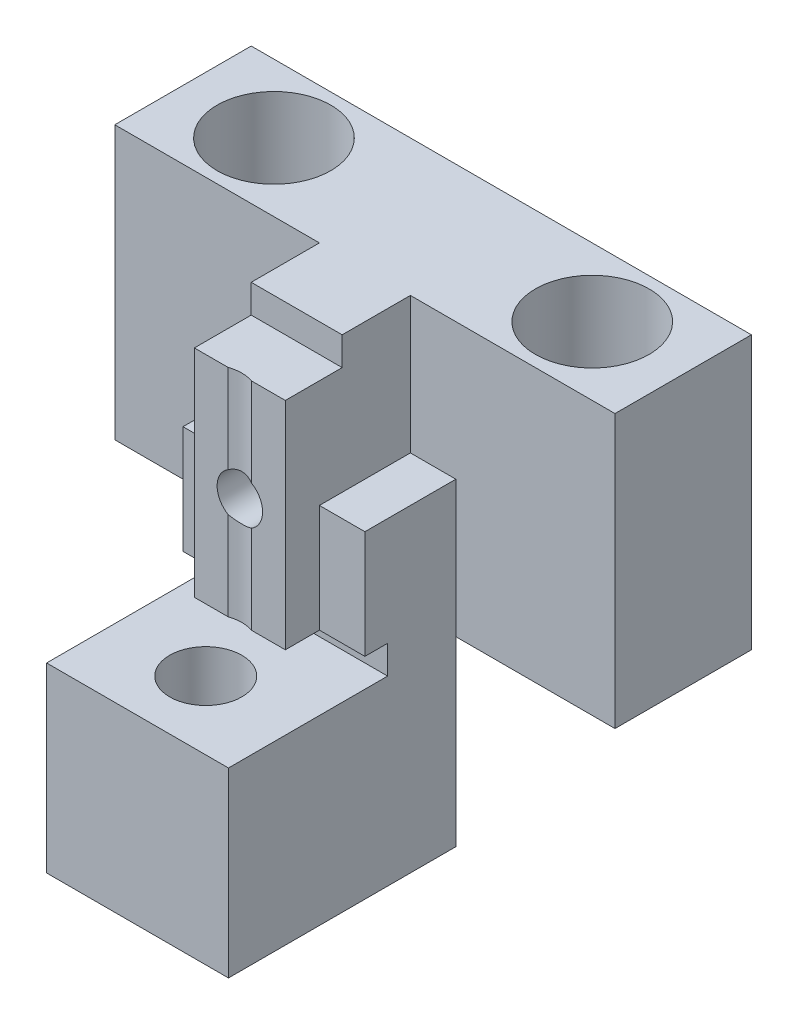
ISO-10303-21;
HEADER;
FILE_DESCRIPTION(('STEP AP214'),'2;1');
FILE_NAME('part.step','',(''),(''),'','','');
FILE_SCHEMA(('AUTOMOTIVE_DESIGN { 1 0 10303 214 1 1 1 1 }'));
ENDSEC;
DATA;
#1=APPLICATION_CONTEXT('core data for automotive mechanical design processes');
#2=APPLICATION_PROTOCOL_DEFINITION('international standard','automotive_design',2000,#1);
#3=PRODUCT_CONTEXT('',#1,'mechanical');
#4=PRODUCT('Part','Part','',(#3));
#5=PRODUCT_RELATED_PRODUCT_CATEGORY('part','',(#4));
#6=PRODUCT_DEFINITION_FORMATION('','',#4);
#7=PRODUCT_DEFINITION_CONTEXT('part definition',#1,'design');
#8=PRODUCT_DEFINITION('design','',#6,#7);
#9=PRODUCT_DEFINITION_SHAPE('','',#8);
#10=(LENGTH_UNIT() NAMED_UNIT(*) SI_UNIT(.MILLI.,.METRE.));
#11=(NAMED_UNIT(*) PLANE_ANGLE_UNIT() SI_UNIT($,.RADIAN.));
#12=(NAMED_UNIT(*) SI_UNIT($,.STERADIAN.) SOLID_ANGLE_UNIT());
#13=UNCERTAINTY_MEASURE_WITH_UNIT(LENGTH_MEASURE(1.E-05),#10,'distance_accuracy_value','');
#14=(GEOMETRIC_REPRESENTATION_CONTEXT(3) GLOBAL_UNCERTAINTY_ASSIGNED_CONTEXT((#13)) GLOBAL_UNIT_ASSIGNED_CONTEXT((#10,
#11,#12)) REPRESENTATION_CONTEXT('',''));
#15=CARTESIAN_POINT('',(0.,0.,0.));
#16=DIRECTION('',(0.,0.,1.));
#17=DIRECTION('',(1.,0.,0.));
#18=AXIS2_PLACEMENT_3D('',#15,#16,#17);
#19=CARTESIAN_POINT('',(0.,-28.,26.));
#20=DIRECTION('',(0.,1.,0.));
#21=DIRECTION('',(0.,0.,1.));
#22=AXIS2_PLACEMENT_3D('',#19,#20,#21);
#23=CYLINDRICAL_SURFACE('',#22,3.175);
#24=CARTESIAN_POINT('',(0.,-28.,26.));
#25=DIRECTION('',(0.,1.,0.));
#26=DIRECTION('',(0.,0.,1.));
#27=AXIS2_PLACEMENT_3D('',#24,#25,#26);
#28=CIRCLE('',#27,3.175);
#29=CARTESIAN_POINT('',(0.,-28.,29.175));
#30=VERTEX_POINT('',#29);
#31=EDGE_CURVE('E270',#30,#30,#28,.T.);
#32=ORIENTED_EDGE('',*,*,#31,.F.);
#33=EDGE_LOOP('',(#32));
#34=FACE_BOUND('',#33,.T.);
#35=CARTESIAN_POINT('',(0.,-12.,26.));
#36=DIRECTION('',(0.,-1.,0.));
#37=DIRECTION('',(0.,0.,-1.));
#38=AXIS2_PLACEMENT_3D('',#35,#36,#37);
#39=CIRCLE('',#38,3.175);
#40=CARTESIAN_POINT('',(0.,-12.,22.825));
#41=VERTEX_POINT('',#40);
#42=EDGE_CURVE('E399',#41,#41,#39,.T.);
#43=ORIENTED_EDGE('',*,*,#42,.F.);
#44=EDGE_LOOP('',(#43));
#45=FACE_BOUND('',#44,.T.);
#46=ADVANCED_FACE('F41',(#34,#45),#23,.F.);
#47=CARTESIAN_POINT('',(0.,0.,23.));
#48=DIRECTION('',(0.,0.,-1.));
#49=DIRECTION('',(-1.,0.,0.));
#50=AXIS2_PLACEMENT_3D('',#47,#48,#49);
#51=PLANE('',#50);
#52=DIRECTION('',(0.,-1.,0.));
#53=VECTOR('',#52,1.);
#54=CARTESIAN_POINT('',(-4.,-12.,23.));
#55=LINE('',#54,#53);
#56=CARTESIAN_POINT('',(-4.,9.5,23.));
#57=VERTEX_POINT('',#56);
#58=CARTESIAN_POINT('',(-4.,-9.5,23.));
#59=VERTEX_POINT('',#58);
#60=EDGE_CURVE('E235',#57,#59,#55,.T.);
#61=ORIENTED_EDGE('',*,*,#60,.T.);
#62=DIRECTION('',(1.,0.,0.));
#63=VECTOR('',#62,1.);
#64=CARTESIAN_POINT('',(0.,-9.5,23.));
#65=LINE('',#64,#63);
#66=CARTESIAN_POINT('',(-1.03953114431459,-9.5,23.));
#67=VERTEX_POINT('',#66);
#68=EDGE_CURVE('E252',#59,#67,#65,.T.);
#69=ORIENTED_EDGE('',*,*,#68,.T.);
#70=DIRECTION('',(0.,1.,0.));
#71=VECTOR('',#70,1.);
#72=CARTESIAN_POINT('',(-1.03953114431459,-28.,23.));
#73=LINE('',#72,#71);
#74=CARTESIAN_POINT('',(-1.03953114431459,-1.70861786248418,23.));
#75=VERTEX_POINT('',#74);
#76=EDGE_CURVE('E280',#67,#75,#73,.T.);
#77=ORIENTED_EDGE('',*,*,#76,.T.);
#78=CARTESIAN_POINT('',(0.,0.,23.));
#79=DIRECTION('',(0.,0.,1.));
#80=DIRECTION('',(1.,0.,0.));
#81=AXIS2_PLACEMENT_3D('',#78,#79,#80);
#82=CIRCLE('',#81,2.);
#83=CARTESIAN_POINT('',(-1.03953114431459,1.70861786248418,23.));
#84=VERTEX_POINT('',#83);
#85=EDGE_CURVE('E268',#84,#75,#82,.T.);
#86=ORIENTED_EDGE('',*,*,#85,.F.);
#87=CARTESIAN_POINT('',(-1.03953114431459,9.5,23.));
#88=VERTEX_POINT('',#87);
#89=EDGE_CURVE('E277',#84,#88,#73,.T.);
#90=ORIENTED_EDGE('',*,*,#89,.T.);
#91=DIRECTION('',(-1.,0.,0.));
#92=VECTOR('',#91,1.);
#93=CARTESIAN_POINT('',(0.,9.5,23.));
#94=LINE('',#93,#92);
#95=EDGE_CURVE('E63',#88,#57,#94,.T.);
#96=ORIENTED_EDGE('',*,*,#95,.T.);
#97=EDGE_LOOP('',(#61,#69,#77,#86,#90,#96));
#98=FACE_BOUND('',#97,.T.);
#99=ADVANCED_FACE('F443',(#98),#51,.F.);
#100=DIRECTION('',(0.,1.,0.));
#101=VECTOR('',#100,1.);
#102=CARTESIAN_POINT('',(1.03953114431459,-28.,23.));
#103=LINE('',#102,#101);
#104=CARTESIAN_POINT('',(1.03953114431459,-1.70861786248418,23.));
#105=VERTEX_POINT('',#104);
#106=CARTESIAN_POINT('',(1.03953114431459,-9.5,23.));
#107=VERTEX_POINT('',#106);
#108=EDGE_CURVE('E272',#105,#107,#103,.F.);
#109=ORIENTED_EDGE('',*,*,#108,.T.);
#110=DIRECTION('',(1.,0.,0.));
#111=VECTOR('',#110,1.);
#112=CARTESIAN_POINT('',(0.,-9.5,23.));
#113=LINE('',#112,#111);
#114=CARTESIAN_POINT('',(4.,-9.5,23.));
#115=VERTEX_POINT('',#114);
#116=EDGE_CURVE('E247',#107,#115,#113,.T.);
#117=ORIENTED_EDGE('',*,*,#116,.T.);
#118=DIRECTION('',(0.,1.,0.));
#119=VECTOR('',#118,1.);
#120=CARTESIAN_POINT('',(4.,-12.,23.));
#121=LINE('',#120,#119);
#122=CARTESIAN_POINT('',(4.,9.5,23.));
#123=VERTEX_POINT('',#122);
#124=EDGE_CURVE('E347',#115,#123,#121,.T.);
#125=ORIENTED_EDGE('',*,*,#124,.T.);
#126=DIRECTION('',(-1.,0.,0.));
#127=VECTOR('',#126,1.);
#128=CARTESIAN_POINT('',(0.,9.5,23.));
#129=LINE('',#128,#127);
#130=CARTESIAN_POINT('',(1.03953114431459,9.5,23.));
#131=VERTEX_POINT('',#130);
#132=EDGE_CURVE('E480',#123,#131,#129,.T.);
#133=ORIENTED_EDGE('',*,*,#132,.T.);
#134=CARTESIAN_POINT('',(1.03953114431459,1.70861786248418,23.));
#135=VERTEX_POINT('',#134);
#136=EDGE_CURVE('E273',#131,#135,#103,.F.);
#137=ORIENTED_EDGE('',*,*,#136,.T.);
#138=EDGE_CURVE('E218',#105,#135,#82,.T.);
#139=ORIENTED_EDGE('',*,*,#138,.F.);
#140=EDGE_LOOP('',(#109,#117,#125,#133,#137,#139));
#141=FACE_BOUND('',#140,.T.);
#142=ADVANCED_FACE('F452',(#141),#51,.F.);
#143=ORIENTED_EDGE('',*,*,#76,.F.);
#144=CARTESIAN_POINT('',(0.,-9.5,26.));
#145=DIRECTION('',(0.,1.,0.));
#146=DIRECTION('',(0.,0.,1.));
#147=AXIS2_PLACEMENT_3D('',#144,#145,#146);
#148=CIRCLE('',#147,3.175);
#149=EDGE_CURVE('E249',#67,#107,#148,.F.);
#150=ORIENTED_EDGE('',*,*,#149,.T.);
#151=ORIENTED_EDGE('',*,*,#108,.F.);
#152=CARTESIAN_POINT('',(1.03953114431459,-1.70861786248418,23.));
#153=CARTESIAN_POINT('',(0.997541196131157,-1.73416155510602,22.9854493533525));
#154=CARTESIAN_POINT('',(0.954468028573031,-1.75824815036549,22.9715134937365));
#155=CARTESIAN_POINT('',(0.866270296265234,-1.80334025385913,22.9451147473165));
#156=CARTESIAN_POINT('',(0.82114445006788,-1.82434380184566,22.932652798617));
#157=CARTESIAN_POINT('',(0.682730376898107,-1.88252250413973,22.8978166729353));
#158=CARTESIAN_POINT('',(0.58660053493359,-1.91474621238144,22.8780616596835));
#159=CARTESIAN_POINT('',(0.38883984730089,-1.96449549665803,22.8473055847078));
#160=CARTESIAN_POINT('',(0.287188754412404,-1.98196245514864,22.8363394433755));
#161=CARTESIAN_POINT('',(0.0820302804462668,-2.00096077241309,22.8244037033069));
#162=CARTESIAN_POINT('',(-0.0214720691625581,-2.00253021424698,22.8234102147819));
#163=CARTESIAN_POINT('',(-0.220353692033777,-1.9901584733068,22.8311928539617));
#164=CARTESIAN_POINT('',(-0.315823650079891,-1.97721890119488,22.8393381220084));
#165=CARTESIAN_POINT('',(-0.503073675052056,-1.93805978380155,22.8636858429527));
#166=CARTESIAN_POINT('',(-0.594848102293492,-1.91182071409481,22.8799001410116));
#167=CARTESIAN_POINT('',(-0.746359528962167,-1.85672246990572,22.9133003303401));
#168=CARTESIAN_POINT('',(-0.807604340821068,-1.83088392427938,22.9288093655041));
#169=CARTESIAN_POINT('',(-0.926381400413361,-1.77373720944711,22.9625252001862));
#170=CARTESIAN_POINT('',(-0.983927919248732,-1.74245204013732,22.980720608505));
#171=CARTESIAN_POINT('',(-1.03953114431459,-1.70861786248418,23.));
#172=B_SPLINE_CURVE_WITH_KNOTS('',3,(#152,#153,#154,#155,#156,#157,#158,#159,#160,#161,#162,
#163,#164,#165,#166,#167,#168,#169,#170,#171),.UNSPECIFIED.,.F.,.F.,(4,2,2,2,2,2,2,2,2,4),(0.,
0.15370416847276,0.307505644939282,0.615817365193148,0.925348095150154,1.2341371574996,
1.52285390286286,1.81199573394711,2.01641354175181,2.21998819660838),.UNSPECIFIED.);
#173=EDGE_CURVE('E412',#105,#75,#172,.T.);
#174=ORIENTED_EDGE('',*,*,#173,.T.);
#175=EDGE_LOOP('',(#143,#150,#151,#174));
#176=FACE_BOUND('',#175,.T.);
#177=ADVANCED_FACE('F446',(#176),#23,.F.);
#178=CARTESIAN_POINT('',(-22.,12.,12.));
#179=DIRECTION('',(0.,-1.,0.));
#180=DIRECTION('',(0.,0.,-1.));
#181=AXIS2_PLACEMENT_3D('',#178,#179,#180);
#182=PLANE('',#181);
#183=CARTESIAN_POINT('',(14.,12.,6.));
#184=DIRECTION('',(0.,1.,0.));
#185=DIRECTION('',(0.,0.,1.));
#186=AXIS2_PLACEMENT_3D('',#183,#184,#185);
#187=CIRCLE('',#186,5.);
#188=CARTESIAN_POINT('',(14.,12.,11.));
#189=VERTEX_POINT('',#188);
#190=EDGE_CURVE('E276',#189,#189,#187,.T.);
#191=ORIENTED_EDGE('',*,*,#190,.F.);
#192=EDGE_LOOP('',(#191));
#193=FACE_BOUND('',#192,.T.);
#194=CARTESIAN_POINT('',(-14.,12.,6.));
#195=DIRECTION('',(0.,1.,0.));
#196=DIRECTION('',(0.,0.,1.));
#197=AXIS2_PLACEMENT_3D('',#194,#195,#196);
#198=CIRCLE('',#197,5.);
#199=CARTESIAN_POINT('',(-14.,12.,11.));
#200=VERTEX_POINT('',#199);
#201=EDGE_CURVE('E278',#200,#200,#198,.T.);
#202=ORIENTED_EDGE('',*,*,#201,.F.);
#203=EDGE_LOOP('',(#202));
#204=FACE_BOUND('',#203,.T.);
#205=DIRECTION('',(0.,0.,-1.));
#206=VECTOR('',#205,1.);
#207=CARTESIAN_POINT('',(-4.,12.,23.));
#208=LINE('',#207,#206);
#209=CARTESIAN_POINT('',(-4.,12.,18.));
#210=VERTEX_POINT('',#209);
#211=CARTESIAN_POINT('',(-4.,12.,12.));
#212=VERTEX_POINT('',#211);
#213=EDGE_CURVE('E348',#210,#212,#208,.T.);
#214=ORIENTED_EDGE('',*,*,#213,.F.);
#215=DIRECTION('',(1.,0.,0.));
#216=VECTOR('',#215,1.);
#217=CARTESIAN_POINT('',(-22.,12.,18.));
#218=LINE('',#217,#216);
#219=CARTESIAN_POINT('',(4.,12.,18.));
#220=VERTEX_POINT('',#219);
#221=EDGE_CURVE('E214',#210,#220,#218,.T.);
#222=ORIENTED_EDGE('',*,*,#221,.T.);
#223=DIRECTION('',(0.,0.,-1.));
#224=VECTOR('',#223,1.);
#225=CARTESIAN_POINT('',(4.,12.,23.));
#226=LINE('',#225,#224);
#227=CARTESIAN_POINT('',(4.,12.,12.));
#228=VERTEX_POINT('',#227);
#229=EDGE_CURVE('E357',#220,#228,#226,.T.);
#230=ORIENTED_EDGE('',*,*,#229,.T.);
#231=DIRECTION('',(-1.,0.,0.));
#232=VECTOR('',#231,1.);
#233=CARTESIAN_POINT('',(-22.,12.,12.));
#234=LINE('',#233,#232);
#235=CARTESIAN_POINT('',(22.,12.,12.));
#236=VERTEX_POINT('',#235);
#237=EDGE_CURVE('E371',#236,#228,#234,.T.);
#238=ORIENTED_EDGE('',*,*,#237,.F.);
#239=DIRECTION('',(0.,0.,-1.));
#240=VECTOR('',#239,1.);
#241=CARTESIAN_POINT('',(22.,12.,12.));
#242=LINE('',#241,#240);
#243=CARTESIAN_POINT('',(22.,12.,0.));
#244=VERTEX_POINT('',#243);
#245=EDGE_CURVE('E383',#236,#244,#242,.T.);
#246=ORIENTED_EDGE('',*,*,#245,.T.);
#247=DIRECTION('',(-1.,0.,0.));
#248=VECTOR('',#247,1.);
#249=CARTESIAN_POINT('',(-22.,12.,0.));
#250=LINE('',#249,#248);
#251=CARTESIAN_POINT('',(-22.,12.,0.));
#252=VERTEX_POINT('',#251);
#253=EDGE_CURVE('E361',#244,#252,#250,.T.);
#254=ORIENTED_EDGE('',*,*,#253,.T.);
#255=DIRECTION('',(0.,0.,-1.));
#256=VECTOR('',#255,1.);
#257=CARTESIAN_POINT('',(-22.,12.,12.));
#258=LINE('',#257,#256);
#259=CARTESIAN_POINT('',(-22.,12.,12.));
#260=VERTEX_POINT('',#259);
#261=EDGE_CURVE('E372',#260,#252,#258,.T.);
#262=ORIENTED_EDGE('',*,*,#261,.F.);
#263=EDGE_CURVE('E367',#212,#260,#234,.T.);
#264=ORIENTED_EDGE('',*,*,#263,.F.);
#265=EDGE_LOOP('',(#214,#222,#230,#238,#246,#254,#262,#264));
#266=FACE_BOUND('',#265,.T.);
#267=ADVANCED_FACE('F460',(#193,#204,#266),#182,.F.);
#268=CARTESIAN_POINT('',(0.,0.,20.));
#269=DIRECTION('',(0.,0.,-1.));
#270=DIRECTION('',(-1.,0.,0.));
#271=AXIS2_PLACEMENT_3D('',#268,#269,#270);
#272=PLANE('',#271);
#273=DIRECTION('',(0.,-1.,0.));
#274=VECTOR('',#273,1.);
#275=CARTESIAN_POINT('',(4.,-12.,20.));
#276=LINE('',#275,#274);
#277=CARTESIAN_POINT('',(4.,0.,20.));
#278=VERTEX_POINT('',#277);
#279=CARTESIAN_POINT('',(4.,-9.5,20.));
#280=VERTEX_POINT('',#279);
#281=EDGE_CURVE('E395',#278,#280,#276,.T.);
#282=ORIENTED_EDGE('',*,*,#281,.T.);
#283=DIRECTION('',(1.,0.,0.));
#284=VECTOR('',#283,1.);
#285=CARTESIAN_POINT('',(0.,-9.5,20.));
#286=LINE('',#285,#284);
#287=CARTESIAN_POINT('',(8.,-9.5,20.));
#288=VERTEX_POINT('',#287);
#289=EDGE_CURVE('E237',#280,#288,#286,.T.);
#290=ORIENTED_EDGE('',*,*,#289,.T.);
#291=DIRECTION('',(0.,1.,0.));
#292=VECTOR('',#291,1.);
#293=CARTESIAN_POINT('',(8.,-28.,20.));
#294=LINE('',#293,#292);
#295=CARTESIAN_POINT('',(8.,0.,20.));
#296=VERTEX_POINT('',#295);
#297=EDGE_CURVE('E306',#288,#296,#294,.T.);
#298=ORIENTED_EDGE('',*,*,#297,.T.);
#299=DIRECTION('',(-1.,0.,0.));
#300=VECTOR('',#299,1.);
#301=CARTESIAN_POINT('',(-8.,0.,20.));
#302=LINE('',#301,#300);
#303=EDGE_CURVE('E315',#296,#278,#302,.T.);
#304=ORIENTED_EDGE('',*,*,#303,.T.);
#305=EDGE_LOOP('',(#282,#290,#298,#304));
#306=FACE_BOUND('',#305,.T.);
#307=ADVANCED_FACE('F493',(#306),#272,.F.);
#308=DIRECTION('',(0.,-1.,0.));
#309=VECTOR('',#308,1.);
#310=CARTESIAN_POINT('',(-8.,-28.,20.));
#311=LINE('',#310,#309);
#312=CARTESIAN_POINT('',(-8.,0.,20.));
#313=VERTEX_POINT('',#312);
#314=CARTESIAN_POINT('',(-8.,-9.5,20.));
#315=VERTEX_POINT('',#314);
#316=EDGE_CURVE('E301',#313,#315,#311,.T.);
#317=ORIENTED_EDGE('',*,*,#316,.T.);
#318=DIRECTION('',(1.,0.,0.));
#319=VECTOR('',#318,1.);
#320=CARTESIAN_POINT('',(0.,-9.5,20.));
#321=LINE('',#320,#319);
#322=CARTESIAN_POINT('',(-4.,-9.5,20.));
#323=VERTEX_POINT('',#322);
#324=EDGE_CURVE('E260',#315,#323,#321,.T.);
#325=ORIENTED_EDGE('',*,*,#324,.T.);
#326=DIRECTION('',(0.,1.,0.));
#327=VECTOR('',#326,1.);
#328=CARTESIAN_POINT('',(-4.,-12.,20.));
#329=LINE('',#328,#327);
#330=CARTESIAN_POINT('',(-4.,0.,20.));
#331=VERTEX_POINT('',#330);
#332=EDGE_CURVE('E338',#323,#331,#329,.T.);
#333=ORIENTED_EDGE('',*,*,#332,.T.);
#334=EDGE_CURVE('E313',#331,#313,#302,.T.);
#335=ORIENTED_EDGE('',*,*,#334,.T.);
#336=EDGE_LOOP('',(#317,#325,#333,#335));
#337=FACE_BOUND('',#336,.T.);
#338=ADVANCED_FACE('F526',(#337),#272,.F.);
#339=CARTESIAN_POINT('',(0.,0.,12.));
#340=DIRECTION('',(0.,0.,-1.));
#341=DIRECTION('',(-1.,0.,0.));
#342=AXIS2_PLACEMENT_3D('',#339,#340,#341);
#343=PLANE('',#342);
#344=DIRECTION('',(0.,-1.,0.));
#345=VECTOR('',#344,1.);
#346=CARTESIAN_POINT('',(-8.,-28.,12.));
#347=LINE('',#346,#345);
#348=CARTESIAN_POINT('',(-8.,0.,12.));
#349=VERTEX_POINT('',#348);
#350=CARTESIAN_POINT('',(-8.,-12.,12.));
#351=VERTEX_POINT('',#350);
#352=EDGE_CURVE('E316',#349,#351,#347,.T.);
#353=ORIENTED_EDGE('',*,*,#352,.F.);
#354=DIRECTION('',(-1.,0.,0.));
#355=VECTOR('',#354,1.);
#356=CARTESIAN_POINT('',(-8.,0.,12.));
#357=LINE('',#356,#355);
#358=CARTESIAN_POINT('',(-4.,0.,12.));
#359=VERTEX_POINT('',#358);
#360=EDGE_CURVE('E324',#359,#349,#357,.T.);
#361=ORIENTED_EDGE('',*,*,#360,.F.);
#362=DIRECTION('',(0.,-1.,0.));
#363=VECTOR('',#362,1.);
#364=CARTESIAN_POINT('',(-4.,-12.,12.));
#365=LINE('',#364,#363);
#366=EDGE_CURVE('E344',#212,#359,#365,.T.);
#367=ORIENTED_EDGE('',*,*,#366,.F.);
#368=ORIENTED_EDGE('',*,*,#263,.T.);
#369=DIRECTION('',(0.,-1.,0.));
#370=VECTOR('',#369,1.);
#371=CARTESIAN_POINT('',(-22.,-12.,12.));
#372=LINE('',#371,#370);
#373=CARTESIAN_POINT('',(-22.,-12.,12.));
#374=VERTEX_POINT('',#373);
#375=EDGE_CURVE('E359',#260,#374,#372,.T.);
#376=ORIENTED_EDGE('',*,*,#375,.T.);
#377=DIRECTION('',(1.,0.,0.));
#378=VECTOR('',#377,1.);
#379=CARTESIAN_POINT('',(-22.,-12.,12.));
#380=LINE('',#379,#378);
#381=EDGE_CURVE('E365',#374,#351,#380,.T.);
#382=ORIENTED_EDGE('',*,*,#381,.T.);
#383=EDGE_LOOP('',(#353,#361,#367,#368,#376,#382));
#384=FACE_BOUND('',#383,.T.);
#385=ADVANCED_FACE('F557',(#384),#343,.F.);
#386=CARTESIAN_POINT('',(8.,0.,12.));
#387=VERTEX_POINT('',#386);
#388=CARTESIAN_POINT('',(4.,0.,12.));
#389=VERTEX_POINT('',#388);
#390=EDGE_CURVE('E310',#387,#389,#357,.T.);
#391=ORIENTED_EDGE('',*,*,#390,.F.);
#392=DIRECTION('',(0.,1.,0.));
#393=VECTOR('',#392,1.);
#394=CARTESIAN_POINT('',(8.,-28.,12.));
#395=LINE('',#394,#393);
#396=CARTESIAN_POINT('',(8.,-12.,12.));
#397=VERTEX_POINT('',#396);
#398=EDGE_CURVE('E321',#397,#387,#395,.T.);
#399=ORIENTED_EDGE('',*,*,#398,.F.);
#400=CARTESIAN_POINT('',(22.,-12.,12.));
#401=VERTEX_POINT('',#400);
#402=EDGE_CURVE('E362',#397,#401,#380,.T.);
#403=ORIENTED_EDGE('',*,*,#402,.T.);
#404=DIRECTION('',(0.,1.,0.));
#405=VECTOR('',#404,1.);
#406=CARTESIAN_POINT('',(22.,-12.,12.));
#407=LINE('',#406,#405);
#408=EDGE_CURVE('E370',#401,#236,#407,.T.);
#409=ORIENTED_EDGE('',*,*,#408,.T.);
#410=ORIENTED_EDGE('',*,*,#237,.T.);
#411=DIRECTION('',(0.,1.,0.));
#412=VECTOR('',#411,1.);
#413=CARTESIAN_POINT('',(4.,-12.,12.));
#414=LINE('',#413,#412);
#415=EDGE_CURVE('E350',#389,#228,#414,.T.);
#416=ORIENTED_EDGE('',*,*,#415,.F.);
#417=EDGE_LOOP('',(#391,#399,#403,#409,#410,#416));
#418=FACE_BOUND('',#417,.T.);
#419=ADVANCED_FACE('F503',(#418),#343,.F.);
#420=CARTESIAN_POINT('',(-4.,-12.,23.));
#421=DIRECTION('',(1.,0.,0.));
#422=DIRECTION('',(0.,0.,-1.));
#423=AXIS2_PLACEMENT_3D('',#420,#421,#422);
#424=PLANE('',#423);
#425=ORIENTED_EDGE('',*,*,#332,.F.);
#426=DIRECTION('',(0.,0.,1.));
#427=VECTOR('',#426,1.);
#428=CARTESIAN_POINT('',(-4.,-9.5,23.));
#429=LINE('',#428,#427);
#430=EDGE_CURVE('E254',#323,#59,#429,.T.);
#431=ORIENTED_EDGE('',*,*,#430,.T.);
#432=ORIENTED_EDGE('',*,*,#60,.F.);
#433=DIRECTION('',(0.,0.,-1.));
#434=VECTOR('',#433,1.);
#435=CARTESIAN_POINT('',(-4.,9.5,23.));
#436=LINE('',#435,#434);
#437=CARTESIAN_POINT('',(-4.,9.5,18.));
#438=VERTEX_POINT('',#437);
#439=EDGE_CURVE('E225',#57,#438,#436,.T.);
#440=ORIENTED_EDGE('',*,*,#439,.T.);
#441=DIRECTION('',(0.,1.,0.));
#442=VECTOR('',#441,1.);
#443=CARTESIAN_POINT('',(-4.,-12.,18.));
#444=LINE('',#443,#442);
#445=EDGE_CURVE('E209',#438,#210,#444,.T.);
#446=ORIENTED_EDGE('',*,*,#445,.T.);
#447=ORIENTED_EDGE('',*,*,#213,.T.);
#448=ORIENTED_EDGE('',*,*,#366,.T.);
#449=DIRECTION('',(0.,0.,-1.));
#450=VECTOR('',#449,1.);
#451=CARTESIAN_POINT('',(-4.,0.,23.));
#452=LINE('',#451,#450);
#453=EDGE_CURVE('E342',#331,#359,#452,.T.);
#454=ORIENTED_EDGE('',*,*,#453,.F.);
#455=EDGE_LOOP('',(#425,#431,#432,#440,#446,#447,#448,#454));
#456=FACE_BOUND('',#455,.T.);
#457=ADVANCED_FACE('F228',(#456),#424,.F.);
#458=CARTESIAN_POINT('',(4.,-12.,23.));
#459=DIRECTION('',(-1.,0.,0.));
#460=DIRECTION('',(0.,0.,1.));
#461=AXIS2_PLACEMENT_3D('',#458,#459,#460);
#462=PLANE('',#461);
#463=ORIENTED_EDGE('',*,*,#124,.F.);
#464=DIRECTION('',(0.,0.,-1.));
#465=VECTOR('',#464,1.);
#466=CARTESIAN_POINT('',(4.,-9.5,23.));
#467=LINE('',#466,#465);
#468=EDGE_CURVE('E245',#115,#280,#467,.T.);
#469=ORIENTED_EDGE('',*,*,#468,.T.);
#470=ORIENTED_EDGE('',*,*,#281,.F.);
#471=DIRECTION('',(0.,0.,1.));
#472=VECTOR('',#471,1.);
#473=CARTESIAN_POINT('',(4.,0.,23.));
#474=LINE('',#473,#472);
#475=EDGE_CURVE('E397',#389,#278,#474,.T.);
#476=ORIENTED_EDGE('',*,*,#475,.F.);
#477=ORIENTED_EDGE('',*,*,#415,.T.);
#478=ORIENTED_EDGE('',*,*,#229,.F.);
#479=DIRECTION('',(0.,-1.,0.));
#480=VECTOR('',#479,1.);
#481=CARTESIAN_POINT('',(4.,-12.,18.));
#482=LINE('',#481,#480);
#483=CARTESIAN_POINT('',(4.,9.5,18.));
#484=VERTEX_POINT('',#483);
#485=EDGE_CURVE('E11',#220,#484,#482,.T.);
#486=ORIENTED_EDGE('',*,*,#485,.T.);
#487=DIRECTION('',(0.,0.,1.));
#488=VECTOR('',#487,1.);
#489=CARTESIAN_POINT('',(4.,9.5,23.));
#490=LINE('',#489,#488);
#491=EDGE_CURVE('E221',#484,#123,#490,.T.);
#492=ORIENTED_EDGE('',*,*,#491,.T.);
#493=EDGE_LOOP('',(#463,#469,#470,#476,#477,#478,#486,#492));
#494=FACE_BOUND('',#493,.T.);
#495=ADVANCED_FACE('F499',(#494),#462,.F.);
#496=CARTESIAN_POINT('',(-22.,-12.,12.));
#497=DIRECTION('',(1.,0.,0.));
#498=DIRECTION('',(0.,0.,-1.));
#499=AXIS2_PLACEMENT_3D('',#496,#497,#498);
#500=PLANE('',#499);
#501=DIRECTION('',(0.,-1.,0.));
#502=VECTOR('',#501,1.);
#503=CARTESIAN_POINT('',(-22.,-12.,0.));
#504=LINE('',#503,#502);
#505=CARTESIAN_POINT('',(-22.,-12.,0.));
#506=VERTEX_POINT('',#505);
#507=EDGE_CURVE('E358',#252,#506,#504,.T.);
#508=ORIENTED_EDGE('',*,*,#507,.T.);
#509=DIRECTION('',(0.,0.,-1.));
#510=VECTOR('',#509,1.);
#511=CARTESIAN_POINT('',(-22.,-12.,12.));
#512=LINE('',#511,#510);
#513=EDGE_CURVE('E388',#374,#506,#512,.T.);
#514=ORIENTED_EDGE('',*,*,#513,.F.);
#515=ORIENTED_EDGE('',*,*,#375,.F.);
#516=ORIENTED_EDGE('',*,*,#261,.T.);
#517=EDGE_LOOP('',(#508,#514,#515,#516));
#518=FACE_BOUND('',#517,.T.);
#519=ADVANCED_FACE('F43',(#518),#500,.F.);
#520=CARTESIAN_POINT('',(-22.,-12.,12.));
#521=DIRECTION('',(0.,1.,0.));
#522=DIRECTION('',(0.,0.,1.));
#523=AXIS2_PLACEMENT_3D('',#520,#521,#522);
#524=PLANE('',#523);
#525=CARTESIAN_POINT('',(-14.,-12.,6.));
#526=DIRECTION('',(0.,1.,0.));
#527=DIRECTION('',(0.,0.,1.));
#528=AXIS2_PLACEMENT_3D('',#525,#526,#527);
#529=CIRCLE('',#528,5.);
#530=CARTESIAN_POINT('',(-14.,-12.,11.));
#531=VERTEX_POINT('',#530);
#532=EDGE_CURVE('E288',#531,#531,#529,.T.);
#533=ORIENTED_EDGE('',*,*,#532,.T.);
#534=EDGE_LOOP('',(#533));
#535=FACE_BOUND('',#534,.T.);
#536=CARTESIAN_POINT('',(14.,-12.,6.));
#537=DIRECTION('',(0.,1.,0.));
#538=DIRECTION('',(0.,0.,1.));
#539=AXIS2_PLACEMENT_3D('',#536,#537,#538);
#540=CIRCLE('',#539,5.);
#541=CARTESIAN_POINT('',(14.,-12.,11.));
#542=VERTEX_POINT('',#541);
#543=EDGE_CURVE('E285',#542,#542,#540,.T.);
#544=ORIENTED_EDGE('',*,*,#543,.T.);
#545=EDGE_LOOP('',(#544));
#546=FACE_BOUND('',#545,.T.);
#547=EDGE_CURVE('E366',#351,#397,#380,.T.);
#548=ORIENTED_EDGE('',*,*,#547,.F.);
#549=ORIENTED_EDGE('',*,*,#381,.F.);
#550=ORIENTED_EDGE('',*,*,#513,.T.);
#551=DIRECTION('',(1.,0.,0.));
#552=VECTOR('',#551,1.);
#553=CARTESIAN_POINT('',(-22.,-12.,0.));
#554=LINE('',#553,#552);
#555=CARTESIAN_POINT('',(22.,-12.,0.));
#556=VERTEX_POINT('',#555);
#557=EDGE_CURVE('E380',#506,#556,#554,.T.);
#558=ORIENTED_EDGE('',*,*,#557,.T.);
#559=DIRECTION('',(0.,0.,-1.));
#560=VECTOR('',#559,1.);
#561=CARTESIAN_POINT('',(22.,-12.,12.));
#562=LINE('',#561,#560);
#563=EDGE_CURVE('E390',#401,#556,#562,.T.);
#564=ORIENTED_EDGE('',*,*,#563,.F.);
#565=ORIENTED_EDGE('',*,*,#402,.F.);
#566=EDGE_LOOP('',(#548,#549,#550,#558,#564,#565));
#567=FACE_BOUND('',#566,.T.);
#568=ADVANCED_FACE('F516',(#535,#546,#567),#524,.F.);
#569=CARTESIAN_POINT('',(22.,-12.,12.));
#570=DIRECTION('',(-1.,0.,0.));
#571=DIRECTION('',(0.,0.,1.));
#572=AXIS2_PLACEMENT_3D('',#569,#570,#571);
#573=PLANE('',#572);
#574=DIRECTION('',(0.,1.,0.));
#575=VECTOR('',#574,1.);
#576=CARTESIAN_POINT('',(22.,-12.,0.));
#577=LINE('',#576,#575);
#578=EDGE_CURVE('E377',#556,#244,#577,.T.);
#579=ORIENTED_EDGE('',*,*,#578,.T.);
#580=ORIENTED_EDGE('',*,*,#245,.F.);
#581=ORIENTED_EDGE('',*,*,#408,.F.);
#582=ORIENTED_EDGE('',*,*,#563,.T.);
#583=EDGE_LOOP('',(#579,#580,#581,#582));
#584=FACE_BOUND('',#583,.T.);
#585=ADVANCED_FACE('F517',(#584),#573,.F.);
#586=CARTESIAN_POINT('',(0.,0.,0.));
#587=DIRECTION('',(0.,0.,-1.));
#588=DIRECTION('',(-1.,0.,0.));
#589=AXIS2_PLACEMENT_3D('',#586,#587,#588);
#590=PLANE('',#589);
#591=ORIENTED_EDGE('',*,*,#507,.F.);
#592=ORIENTED_EDGE('',*,*,#253,.F.);
#593=ORIENTED_EDGE('',*,*,#578,.F.);
#594=ORIENTED_EDGE('',*,*,#557,.F.);
#595=EDGE_LOOP('',(#591,#592,#593,#594));
#596=FACE_BOUND('',#595,.T.);
#597=ADVANCED_FACE('F564',(#596),#590,.T.);
#598=CARTESIAN_POINT('',(0.,0.,12.));
#599=DIRECTION('',(0.,0.,-1.));
#600=DIRECTION('',(-1.,0.,0.));
#601=AXIS2_PLACEMENT_3D('',#598,#599,#600);
#602=PLANE('',#601);
#603=ORIENTED_EDGE('',*,*,#547,.T.);
#604=CARTESIAN_POINT('',(8.,-28.,12.));
#605=VERTEX_POINT('',#604);
#606=EDGE_CURVE('E325',#605,#397,#395,.T.);
#607=ORIENTED_EDGE('',*,*,#606,.F.);
#608=DIRECTION('',(1.,0.,0.));
#609=VECTOR('',#608,1.);
#610=CARTESIAN_POINT('',(-8.,-28.,12.));
#611=LINE('',#610,#609);
#612=CARTESIAN_POINT('',(-8.,-28.,12.));
#613=VERTEX_POINT('',#612);
#614=EDGE_CURVE('E317',#613,#605,#611,.T.);
#615=ORIENTED_EDGE('',*,*,#614,.F.);
#616=EDGE_CURVE('E304',#351,#613,#347,.T.);
#617=ORIENTED_EDGE('',*,*,#616,.F.);
#618=EDGE_LOOP('',(#603,#607,#615,#617));
#619=FACE_BOUND('',#618,.T.);
#620=ADVANCED_FACE('F512',(#619),#602,.T.);
#621=CARTESIAN_POINT('',(-8.,0.,20.));
#622=DIRECTION('',(0.,-1.,0.));
#623=DIRECTION('',(0.,0.,-1.));
#624=AXIS2_PLACEMENT_3D('',#621,#622,#623);
#625=PLANE('',#624);
#626=ORIENTED_EDGE('',*,*,#334,.F.);
#627=ORIENTED_EDGE('',*,*,#453,.T.);
#628=ORIENTED_EDGE('',*,*,#360,.T.);
#629=DIRECTION('',(0.,0.,-1.));
#630=VECTOR('',#629,1.);
#631=CARTESIAN_POINT('',(-8.,0.,20.));
#632=LINE('',#631,#630);
#633=EDGE_CURVE('E312',#313,#349,#632,.T.);
#634=ORIENTED_EDGE('',*,*,#633,.F.);
#635=EDGE_LOOP('',(#626,#627,#628,#634));
#636=FACE_BOUND('',#635,.T.);
#637=ADVANCED_FACE('F594',(#636),#625,.F.);
#638=ORIENTED_EDGE('',*,*,#390,.T.);
#639=ORIENTED_EDGE('',*,*,#475,.T.);
#640=ORIENTED_EDGE('',*,*,#303,.F.);
#641=DIRECTION('',(0.,0.,-1.));
#642=VECTOR('',#641,1.);
#643=CARTESIAN_POINT('',(8.,0.,20.));
#644=LINE('',#643,#642);
#645=EDGE_CURVE('E329',#296,#387,#644,.T.);
#646=ORIENTED_EDGE('',*,*,#645,.T.);
#647=EDGE_LOOP('',(#638,#639,#640,#646));
#648=FACE_BOUND('',#647,.T.);
#649=ADVANCED_FACE('F504',(#648),#625,.F.);
#650=CARTESIAN_POINT('',(-8.,-28.,20.));
#651=DIRECTION('',(1.,0.,0.));
#652=DIRECTION('',(0.,0.,-1.));
#653=AXIS2_PLACEMENT_3D('',#650,#651,#652);
#654=PLANE('',#653);
#655=DIRECTION('',(0.,0.,-1.));
#656=VECTOR('',#655,1.);
#657=CARTESIAN_POINT('',(-8.,-12.,32.));
#658=LINE('',#657,#656);
#659=CARTESIAN_POINT('',(-8.,-12.,32.));
#660=VERTEX_POINT('',#659);
#661=CARTESIAN_POINT('',(-8.,-12.,18.));
#662=VERTEX_POINT('',#661);
#663=EDGE_CURVE('E302',#660,#662,#658,.T.);
#664=ORIENTED_EDGE('',*,*,#663,.T.);
#665=DIRECTION('',(0.,1.,0.));
#666=VECTOR('',#665,1.);
#667=CARTESIAN_POINT('',(-8.,-28.,18.));
#668=LINE('',#667,#666);
#669=CARTESIAN_POINT('',(-8.,-9.5,18.));
#670=VERTEX_POINT('',#669);
#671=EDGE_CURVE('E233',#662,#670,#668,.T.);
#672=ORIENTED_EDGE('',*,*,#671,.T.);
#673=DIRECTION('',(0.,0.,1.));
#674=VECTOR('',#673,1.);
#675=CARTESIAN_POINT('',(-8.,-9.5,20.));
#676=LINE('',#675,#674);
#677=EDGE_CURVE('E257',#670,#315,#676,.T.);
#678=ORIENTED_EDGE('',*,*,#677,.T.);
#679=ORIENTED_EDGE('',*,*,#316,.F.);
#680=ORIENTED_EDGE('',*,*,#633,.T.);
#681=ORIENTED_EDGE('',*,*,#352,.T.);
#682=ORIENTED_EDGE('',*,*,#616,.T.);
#683=DIRECTION('',(0.,0.,-1.));
#684=VECTOR('',#683,1.);
#685=CARTESIAN_POINT('',(-8.,-28.,20.));
#686=LINE('',#685,#684);
#687=CARTESIAN_POINT('',(-8.,-28.,32.));
#688=VERTEX_POINT('',#687);
#689=EDGE_CURVE('E339',#688,#613,#686,.T.);
#690=ORIENTED_EDGE('',*,*,#689,.F.);
#691=DIRECTION('',(0.,-1.,0.));
#692=VECTOR('',#691,1.);
#693=CARTESIAN_POINT('',(-8.,-28.,32.));
#694=LINE('',#693,#692);
#695=EDGE_CURVE('E292',#660,#688,#694,.T.);
#696=ORIENTED_EDGE('',*,*,#695,.F.);
#697=EDGE_LOOP('',(#664,#672,#678,#679,#680,#681,#682,#690,#696));
#698=FACE_BOUND('',#697,.T.);
#699=ADVANCED_FACE('F535',(#698),#654,.F.);
#700=CARTESIAN_POINT('',(-8.,-28.,20.));
#701=DIRECTION('',(0.,1.,0.));
#702=DIRECTION('',(0.,0.,1.));
#703=AXIS2_PLACEMENT_3D('',#700,#701,#702);
#704=PLANE('',#703);
#705=ORIENTED_EDGE('',*,*,#31,.T.);
#706=EDGE_LOOP('',(#705));
#707=FACE_BOUND('',#706,.T.);
#708=ORIENTED_EDGE('',*,*,#614,.T.);
#709=DIRECTION('',(0.,0.,-1.));
#710=VECTOR('',#709,1.);
#711=CARTESIAN_POINT('',(8.,-28.,20.));
#712=LINE('',#711,#710);
#713=CARTESIAN_POINT('',(8.,-28.,32.));
#714=VERTEX_POINT('',#713);
#715=EDGE_CURVE('E334',#714,#605,#712,.T.);
#716=ORIENTED_EDGE('',*,*,#715,.F.);
#717=DIRECTION('',(1.,0.,0.));
#718=VECTOR('',#717,1.);
#719=CARTESIAN_POINT('',(-8.,-28.,32.));
#720=LINE('',#719,#718);
#721=EDGE_CURVE('E294',#688,#714,#720,.T.);
#722=ORIENTED_EDGE('',*,*,#721,.F.);
#723=ORIENTED_EDGE('',*,*,#689,.T.);
#724=EDGE_LOOP('',(#708,#716,#722,#723));
#725=FACE_BOUND('',#724,.T.);
#726=ADVANCED_FACE('F542',(#707,#725),#704,.F.);
#727=CARTESIAN_POINT('',(8.,-28.,20.));
#728=DIRECTION('',(-1.,0.,0.));
#729=DIRECTION('',(0.,0.,1.));
#730=AXIS2_PLACEMENT_3D('',#727,#728,#729);
#731=PLANE('',#730);
#732=DIRECTION('',(0.,-1.,0.));
#733=VECTOR('',#732,1.);
#734=CARTESIAN_POINT('',(8.,-28.,18.));
#735=LINE('',#734,#733);
#736=CARTESIAN_POINT('',(8.,-9.5,18.));
#737=VERTEX_POINT('',#736);
#738=CARTESIAN_POINT('',(8.,-12.,18.));
#739=VERTEX_POINT('',#738);
#740=EDGE_CURVE('E483',#737,#739,#735,.T.);
#741=ORIENTED_EDGE('',*,*,#740,.T.);
#742=DIRECTION('',(0.,0.,-1.));
#743=VECTOR('',#742,1.);
#744=CARTESIAN_POINT('',(8.,-12.,32.));
#745=LINE('',#744,#743);
#746=CARTESIAN_POINT('',(8.,-12.,32.));
#747=VERTEX_POINT('',#746);
#748=EDGE_CURVE('E57',#747,#739,#745,.T.);
#749=ORIENTED_EDGE('',*,*,#748,.F.);
#750=DIRECTION('',(0.,1.,0.));
#751=VECTOR('',#750,1.);
#752=CARTESIAN_POINT('',(8.,-28.,32.));
#753=LINE('',#752,#751);
#754=EDGE_CURVE('E296',#714,#747,#753,.T.);
#755=ORIENTED_EDGE('',*,*,#754,.F.);
#756=ORIENTED_EDGE('',*,*,#715,.T.);
#757=ORIENTED_EDGE('',*,*,#606,.T.);
#758=ORIENTED_EDGE('',*,*,#398,.T.);
#759=ORIENTED_EDGE('',*,*,#645,.F.);
#760=ORIENTED_EDGE('',*,*,#297,.F.);
#761=DIRECTION('',(0.,0.,-1.));
#762=VECTOR('',#761,1.);
#763=CARTESIAN_POINT('',(8.,-9.5,20.));
#764=LINE('',#763,#762);
#765=EDGE_CURVE('E47',#288,#737,#764,.T.);
#766=ORIENTED_EDGE('',*,*,#765,.T.);
#767=EDGE_LOOP('',(#741,#749,#755,#756,#757,#758,#759,#760,#766));
#768=FACE_BOUND('',#767,.T.);
#769=ADVANCED_FACE('F487',(#768),#731,.F.);
#770=CARTESIAN_POINT('',(-8.,-12.,32.));
#771=DIRECTION('',(0.,-1.,0.));
#772=DIRECTION('',(0.,0.,-1.));
#773=AXIS2_PLACEMENT_3D('',#770,#771,#772);
#774=PLANE('',#773);
#775=ORIENTED_EDGE('',*,*,#42,.T.);
#776=EDGE_LOOP('',(#775));
#777=FACE_BOUND('',#776,.T.);
#778=DIRECTION('',(1.,0.,0.));
#779=VECTOR('',#778,1.);
#780=CARTESIAN_POINT('',(-22.,-12.,18.));
#781=LINE('',#780,#779);
#782=EDGE_CURVE('E223',#662,#739,#781,.T.);
#783=ORIENTED_EDGE('',*,*,#782,.F.);
#784=ORIENTED_EDGE('',*,*,#663,.F.);
#785=DIRECTION('',(-1.,0.,0.));
#786=VECTOR('',#785,1.);
#787=CARTESIAN_POINT('',(-8.,-12.,32.));
#788=LINE('',#787,#786);
#789=EDGE_CURVE('E298',#747,#660,#788,.T.);
#790=ORIENTED_EDGE('',*,*,#789,.F.);
#791=ORIENTED_EDGE('',*,*,#748,.T.);
#792=EDGE_LOOP('',(#783,#784,#790,#791));
#793=FACE_BOUND('',#792,.T.);
#794=ADVANCED_FACE('F536',(#777,#793),#774,.F.);
#795=CARTESIAN_POINT('',(0.,0.,32.));
#796=DIRECTION('',(0.,0.,-1.));
#797=DIRECTION('',(-1.,0.,0.));
#798=AXIS2_PLACEMENT_3D('',#795,#796,#797);
#799=PLANE('',#798);
#800=ORIENTED_EDGE('',*,*,#695,.T.);
#801=ORIENTED_EDGE('',*,*,#721,.T.);
#802=ORIENTED_EDGE('',*,*,#754,.T.);
#803=ORIENTED_EDGE('',*,*,#789,.T.);
#804=EDGE_LOOP('',(#800,#801,#802,#803));
#805=FACE_BOUND('',#804,.T.);
#806=ADVANCED_FACE('F545',(#805),#799,.F.);
#807=CARTESIAN_POINT('',(14.,-28.,6.));
#808=DIRECTION('',(0.,1.,0.));
#809=DIRECTION('',(0.,0.,1.));
#810=AXIS2_PLACEMENT_3D('',#807,#808,#809);
#811=CYLINDRICAL_SURFACE('',#810,5.);
#812=ORIENTED_EDGE('',*,*,#190,.T.);
#813=EDGE_LOOP('',(#812));
#814=FACE_BOUND('',#813,.T.);
#815=ORIENTED_EDGE('',*,*,#543,.F.);
#816=EDGE_LOOP('',(#815));
#817=FACE_BOUND('',#816,.T.);
#818=ADVANCED_FACE('F467',(#814,#817),#811,.F.);
#819=CARTESIAN_POINT('',(-14.,-28.,6.));
#820=DIRECTION('',(0.,1.,0.));
#821=DIRECTION('',(0.,0.,1.));
#822=AXIS2_PLACEMENT_3D('',#819,#820,#821);
#823=CYLINDRICAL_SURFACE('',#822,5.);
#824=ORIENTED_EDGE('',*,*,#201,.T.);
#825=EDGE_LOOP('',(#824));
#826=FACE_BOUND('',#825,.T.);
#827=ORIENTED_EDGE('',*,*,#532,.F.);
#828=EDGE_LOOP('',(#827));
#829=FACE_BOUND('',#828,.T.);
#830=ADVANCED_FACE('F458',(#826,#829),#823,.F.);
#831=ORIENTED_EDGE('',*,*,#136,.F.);
#832=CARTESIAN_POINT('',(0.,9.5,26.));
#833=DIRECTION('',(0.,-1.,0.));
#834=DIRECTION('',(0.,0.,-1.));
#835=AXIS2_PLACEMENT_3D('',#832,#833,#834);
#836=CIRCLE('',#835,3.175);
#837=EDGE_CURVE('E466',#131,#88,#836,.F.);
#838=ORIENTED_EDGE('',*,*,#837,.T.);
#839=ORIENTED_EDGE('',*,*,#89,.F.);
#840=CARTESIAN_POINT('',(-1.03953114431459,1.70861786248418,23.));
#841=CARTESIAN_POINT('',(-0.997541196131157,1.73416155510602,22.9854493533525));
#842=CARTESIAN_POINT('',(-0.954468028573031,1.75824815036549,22.9715134937365));
#843=CARTESIAN_POINT('',(-0.866270296265234,1.80334025385913,22.9451147473165));
#844=CARTESIAN_POINT('',(-0.82114445006788,1.82434380184566,22.932652798617));
#845=CARTESIAN_POINT('',(-0.682730376898107,1.88252250413973,22.8978166729353));
#846=CARTESIAN_POINT('',(-0.58660053493359,1.91474621238144,22.8780616596835));
#847=CARTESIAN_POINT('',(-0.38883984730089,1.96449549665803,22.8473055847078));
#848=CARTESIAN_POINT('',(-0.287188754412404,1.98196245514864,22.8363394433755));
#849=CARTESIAN_POINT('',(-0.0820302804462668,2.00096077241309,22.8244037033069));
#850=CARTESIAN_POINT('',(0.0214720691625581,2.00253021424698,22.8234102147819));
#851=CARTESIAN_POINT('',(0.220353692033777,1.9901584733068,22.8311928539617));
#852=CARTESIAN_POINT('',(0.315823650079891,1.97721890119488,22.8393381220084));
#853=CARTESIAN_POINT('',(0.503073675052056,1.93805978380155,22.8636858429527));
#854=CARTESIAN_POINT('',(0.594848102293492,1.91182071409481,22.8799001410116));
#855=CARTESIAN_POINT('',(0.746359528962167,1.85672246990572,22.9133003303401));
#856=CARTESIAN_POINT('',(0.807604340821068,1.83088392427938,22.9288093655041));
#857=CARTESIAN_POINT('',(0.926381400413361,1.77373720944711,22.9625252001862));
#858=CARTESIAN_POINT('',(0.983927919248732,1.74245204013732,22.980720608505));
#859=CARTESIAN_POINT('',(1.03953114431459,1.70861786248418,23.));
#860=B_SPLINE_CURVE_WITH_KNOTS('',3,(#840,#841,#842,#843,#844,#845,#846,#847,#848,#849,#850,
#851,#852,#853,#854,#855,#856,#857,#858,#859),.UNSPECIFIED.,.F.,.F.,(4,2,2,2,2,2,2,2,2,4),(0.,
0.15370416847276,0.307505644939282,0.615817365193148,0.925348095150154,1.2341371574996,
1.52285390286286,1.81199573394711,2.01641354175181,2.21998819660838),.UNSPECIFIED.);
#861=EDGE_CURVE('E405',#84,#135,#860,.T.);
#862=ORIENTED_EDGE('',*,*,#861,.T.);
#863=EDGE_LOOP('',(#831,#838,#839,#862));
#864=FACE_BOUND('',#863,.T.);
#865=ADVANCED_FACE('F417',(#864),#23,.F.);
#866=CARTESIAN_POINT('',(0.,0.,12.));
#867=DIRECTION('',(0.,0.,1.));
#868=DIRECTION('',(1.,0.,0.));
#869=AXIS2_PLACEMENT_3D('',#866,#867,#868);
#870=CYLINDRICAL_SURFACE('',#869,2.);
#871=CARTESIAN_POINT('',(0.,0.,12.));
#872=DIRECTION('',(0.,0.,1.));
#873=DIRECTION('',(1.,0.,0.));
#874=AXIS2_PLACEMENT_3D('',#871,#872,#873);
#875=CIRCLE('',#874,2.);
#876=CARTESIAN_POINT('',(2.,0.,12.));
#877=VERTEX_POINT('',#876);
#878=EDGE_CURVE('E262',#877,#877,#875,.T.);
#879=ORIENTED_EDGE('',*,*,#878,.F.);
#880=EDGE_LOOP('',(#879));
#881=FACE_BOUND('',#880,.T.);
#882=ORIENTED_EDGE('',*,*,#138,.T.);
#883=ORIENTED_EDGE('',*,*,#861,.F.);
#884=ORIENTED_EDGE('',*,*,#85,.T.);
#885=ORIENTED_EDGE('',*,*,#173,.F.);
#886=EDGE_LOOP('',(#882,#883,#884,#885));
#887=FACE_BOUND('',#886,.T.);
#888=ADVANCED_FACE('F419',(#881,#887),#870,.F.);
#889=CARTESIAN_POINT('',(0.,0.,12.));
#890=DIRECTION('',(0.,0.,1.));
#891=DIRECTION('',(1.,0.,0.));
#892=AXIS2_PLACEMENT_3D('',#889,#890,#891);
#893=PLANE('',#892);
#894=ORIENTED_EDGE('',*,*,#878,.T.);
#895=EDGE_LOOP('',(#894));
#896=FACE_BOUND('',#895,.T.);
#897=ADVANCED_FACE('F424',(#896),#893,.T.);
#898=CARTESIAN_POINT('',(-22.,9.5,18.));
#899=DIRECTION('',(0.,0.,-1.));
#900=DIRECTION('',(-1.,0.,0.));
#901=AXIS2_PLACEMENT_3D('',#898,#899,#900);
#902=PLANE('',#901);
#903=DIRECTION('',(1.,0.,0.));
#904=VECTOR('',#903,1.);
#905=CARTESIAN_POINT('',(-22.,9.5,18.));
#906=LINE('',#905,#904);
#907=EDGE_CURVE('E213',#438,#484,#906,.T.);
#908=ORIENTED_EDGE('',*,*,#907,.T.);
#909=ORIENTED_EDGE('',*,*,#485,.F.);
#910=ORIENTED_EDGE('',*,*,#221,.F.);
#911=ORIENTED_EDGE('',*,*,#445,.F.);
#912=EDGE_LOOP('',(#908,#909,#910,#911));
#913=FACE_BOUND('',#912,.T.);
#914=ADVANCED_FACE('F215',(#913),#902,.F.);
#915=CARTESIAN_POINT('',(-22.,9.5,23.5));
#916=DIRECTION('',(0.,-1.,0.));
#917=DIRECTION('',(0.,0.,-1.));
#918=AXIS2_PLACEMENT_3D('',#915,#916,#917);
#919=PLANE('',#918);
#920=ORIENTED_EDGE('',*,*,#95,.F.);
#921=ORIENTED_EDGE('',*,*,#837,.F.);
#922=ORIENTED_EDGE('',*,*,#132,.F.);
#923=ORIENTED_EDGE('',*,*,#491,.F.);
#924=ORIENTED_EDGE('',*,*,#907,.F.);
#925=ORIENTED_EDGE('',*,*,#439,.F.);
#926=EDGE_LOOP('',(#920,#921,#922,#923,#924,#925));
#927=FACE_BOUND('',#926,.T.);
#928=ADVANCED_FACE('F222',(#927),#919,.F.);
#929=CARTESIAN_POINT('',(-22.,-9.5,18.));
#930=DIRECTION('',(0.,1.,0.));
#931=DIRECTION('',(0.,0.,1.));
#932=AXIS2_PLACEMENT_3D('',#929,#930,#931);
#933=PLANE('',#932);
#934=DIRECTION('',(1.,0.,0.));
#935=VECTOR('',#934,1.);
#936=CARTESIAN_POINT('',(-22.,-9.5,18.));
#937=LINE('',#936,#935);
#938=EDGE_CURVE('E495',#670,#737,#937,.T.);
#939=ORIENTED_EDGE('',*,*,#938,.T.);
#940=ORIENTED_EDGE('',*,*,#765,.F.);
#941=ORIENTED_EDGE('',*,*,#289,.F.);
#942=ORIENTED_EDGE('',*,*,#468,.F.);
#943=ORIENTED_EDGE('',*,*,#116,.F.);
#944=ORIENTED_EDGE('',*,*,#149,.F.);
#945=ORIENTED_EDGE('',*,*,#68,.F.);
#946=ORIENTED_EDGE('',*,*,#430,.F.);
#947=ORIENTED_EDGE('',*,*,#324,.F.);
#948=ORIENTED_EDGE('',*,*,#677,.F.);
#949=EDGE_LOOP('',(#939,#940,#941,#942,#943,#944,#945,#946,#947,#948));
#950=FACE_BOUND('',#949,.T.);
#951=ADVANCED_FACE('F432',(#950),#933,.F.);
#952=CARTESIAN_POINT('',(-22.,-12.,18.));
#953=DIRECTION('',(0.,0.,-1.));
#954=DIRECTION('',(-1.,0.,0.));
#955=AXIS2_PLACEMENT_3D('',#952,#953,#954);
#956=PLANE('',#955);
#957=ORIENTED_EDGE('',*,*,#782,.T.);
#958=ORIENTED_EDGE('',*,*,#740,.F.);
#959=ORIENTED_EDGE('',*,*,#938,.F.);
#960=ORIENTED_EDGE('',*,*,#671,.F.);
#961=EDGE_LOOP('',(#957,#958,#959,#960));
#962=FACE_BOUND('',#961,.T.);
#963=ADVANCED_FACE('F434',(#962),#956,.F.);
#964=CLOSED_SHELL('',(#46,#99,#142,#177,#267,#307,#338,#385,#419,#457,#495,#519,#568,#585,#597,
#620,#637,#649,#699,#726,#769,#794,#806,#818,#830,#865,#888,#897,#914,#928,#951,#963));
#965=MANIFOLD_SOLID_BREP('B2',#964);
#966=ADVANCED_BREP_SHAPE_REPRESENTATION('',(#18,#965),#14);
#967=SHAPE_DEFINITION_REPRESENTATION(#9,#966);
ENDSEC;
END-ISO-10303-21;
